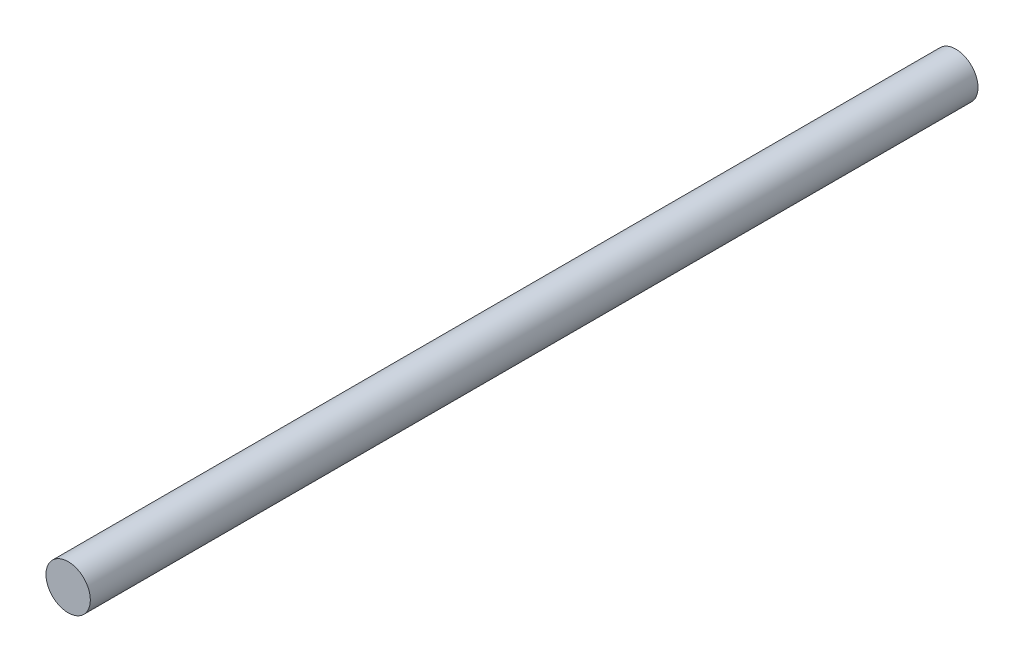
ISO-10303-21;
HEADER;
FILE_DESCRIPTION(('STEP AP214'),'2;1');
FILE_NAME('part.step','',(''),(''),'','','');
FILE_SCHEMA(('AUTOMOTIVE_DESIGN { 1 0 10303 214 1 1 1 1 }'));
ENDSEC;
DATA;
#1=APPLICATION_CONTEXT('core data for automotive mechanical design processes');
#2=APPLICATION_PROTOCOL_DEFINITION('international standard','automotive_design',2000,#1);
#3=PRODUCT_CONTEXT('',#1,'mechanical');
#4=PRODUCT('Part','Part','',(#3));
#5=PRODUCT_RELATED_PRODUCT_CATEGORY('part','',(#4));
#6=PRODUCT_DEFINITION_FORMATION('','',#4);
#7=PRODUCT_DEFINITION_CONTEXT('part definition',#1,'design');
#8=PRODUCT_DEFINITION('design','',#6,#7);
#9=PRODUCT_DEFINITION_SHAPE('','',#8);
#10=(LENGTH_UNIT() NAMED_UNIT(*) SI_UNIT(.MILLI.,.METRE.));
#11=(NAMED_UNIT(*) PLANE_ANGLE_UNIT() SI_UNIT($,.RADIAN.));
#12=(NAMED_UNIT(*) SI_UNIT($,.STERADIAN.) SOLID_ANGLE_UNIT());
#13=UNCERTAINTY_MEASURE_WITH_UNIT(LENGTH_MEASURE(1.E-05),#10,'distance_accuracy_value','');
#14=(GEOMETRIC_REPRESENTATION_CONTEXT(3) GLOBAL_UNCERTAINTY_ASSIGNED_CONTEXT((#13)) GLOBAL_UNIT_ASSIGNED_CONTEXT((#10,
#11,#12)) REPRESENTATION_CONTEXT('',''));
#15=CARTESIAN_POINT('',(0.,0.,0.));
#16=DIRECTION('',(0.,0.,1.));
#17=DIRECTION('',(1.,0.,0.));
#18=AXIS2_PLACEMENT_3D('',#15,#16,#17);
#19=CARTESIAN_POINT('',(0.,0.,80.));
#20=DIRECTION('',(0.,0.,-1.));
#21=DIRECTION('',(-1.,0.,0.));
#22=AXIS2_PLACEMENT_3D('',#19,#20,#21);
#23=CYLINDRICAL_SURFACE('',#22,2.);
#24=CARTESIAN_POINT('',(0.,0.,80.));
#25=DIRECTION('',(0.,0.,1.));
#26=DIRECTION('',(1.,0.,0.));
#27=AXIS2_PLACEMENT_3D('',#24,#25,#26);
#28=CIRCLE('',#27,2.);
#29=CARTESIAN_POINT('',(2.,0.,80.));
#30=VERTEX_POINT('',#29);
#31=EDGE_CURVE('E10',#30,#30,#28,.T.);
#32=ORIENTED_EDGE('',*,*,#31,.F.);
#33=EDGE_LOOP('',(#32));
#34=FACE_BOUND('',#33,.T.);
#35=CARTESIAN_POINT('',(0.,0.,0.));
#36=DIRECTION('',(0.,0.,1.));
#37=DIRECTION('',(1.,0.,0.));
#38=AXIS2_PLACEMENT_3D('',#35,#36,#37);
#39=CIRCLE('',#38,2.);
#40=CARTESIAN_POINT('',(2.,0.,0.));
#41=VERTEX_POINT('',#40);
#42=EDGE_CURVE('E36',#41,#41,#39,.T.);
#43=ORIENTED_EDGE('',*,*,#42,.T.);
#44=EDGE_LOOP('',(#43));
#45=FACE_BOUND('',#44,.T.);
#46=ADVANCED_FACE('F33',(#34,#45),#23,.T.);
#47=CARTESIAN_POINT('',(0.,0.,80.));
#48=DIRECTION('',(0.,0.,1.));
#49=DIRECTION('',(1.,0.,0.));
#50=AXIS2_PLACEMENT_3D('',#47,#48,#49);
#51=PLANE('',#50);
#52=ORIENTED_EDGE('',*,*,#31,.T.);
#53=EDGE_LOOP('',(#52));
#54=FACE_BOUND('',#53,.T.);
#55=ADVANCED_FACE('F48',(#54),#51,.T.);
#56=CARTESIAN_POINT('',(0.,0.,0.));
#57=DIRECTION('',(0.,0.,1.));
#58=DIRECTION('',(1.,0.,0.));
#59=AXIS2_PLACEMENT_3D('',#56,#57,#58);
#60=PLANE('',#59);
#61=ORIENTED_EDGE('',*,*,#42,.F.);
#62=EDGE_LOOP('',(#61));
#63=FACE_BOUND('',#62,.T.);
#64=ADVANCED_FACE('F46',(#63),#60,.F.);
#65=CLOSED_SHELL('',(#46,#55,#64));
#66=MANIFOLD_SOLID_BREP('B2',#65);
#67=ADVANCED_BREP_SHAPE_REPRESENTATION('',(#18,#66),#14);
#68=SHAPE_DEFINITION_REPRESENTATION(#9,#67);
ENDSEC;
END-ISO-10303-21;
